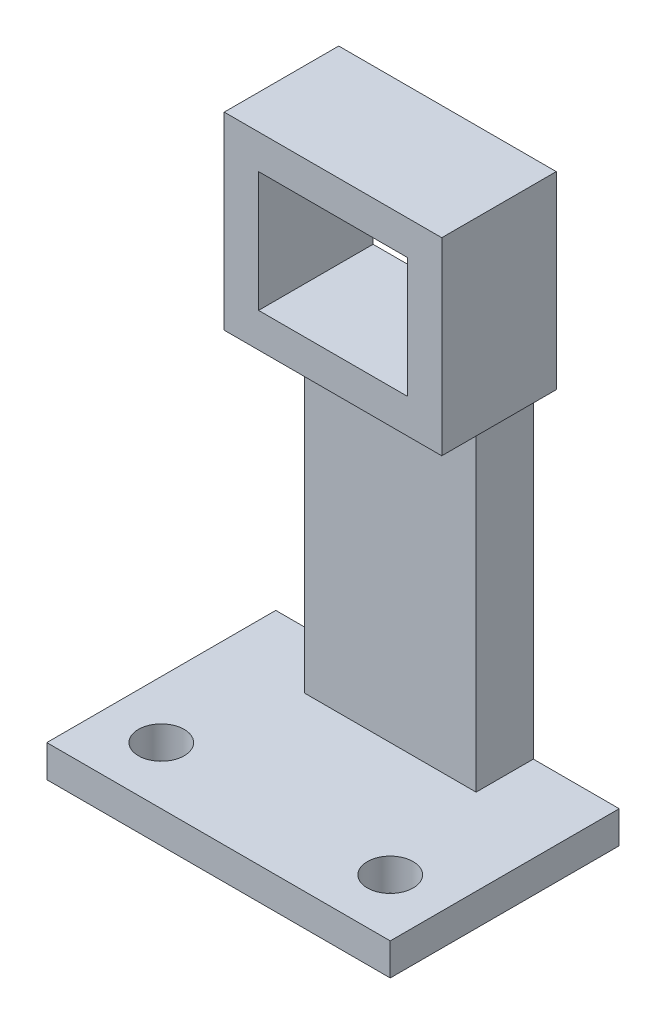
ISO-10303-21;
HEADER;
FILE_DESCRIPTION(('STEP AP214'),'2;1');
FILE_NAME('part.step','',(''),(''),'','','');
FILE_SCHEMA(('AUTOMOTIVE_DESIGN { 1 0 10303 214 1 1 1 1 }'));
ENDSEC;
DATA;
#1=APPLICATION_CONTEXT('core data for automotive mechanical design processes');
#2=APPLICATION_PROTOCOL_DEFINITION('international standard','automotive_design',2000,#1);
#3=PRODUCT_CONTEXT('',#1,'mechanical');
#4=PRODUCT('Part','Part','',(#3));
#5=PRODUCT_RELATED_PRODUCT_CATEGORY('part','',(#4));
#6=PRODUCT_DEFINITION_FORMATION('','',#4);
#7=PRODUCT_DEFINITION_CONTEXT('part definition',#1,'design');
#8=PRODUCT_DEFINITION('design','',#6,#7);
#9=PRODUCT_DEFINITION_SHAPE('','',#8);
#10=(LENGTH_UNIT() NAMED_UNIT(*) SI_UNIT(.MILLI.,.METRE.));
#11=(NAMED_UNIT(*) PLANE_ANGLE_UNIT() SI_UNIT($,.RADIAN.));
#12=(NAMED_UNIT(*) SI_UNIT($,.STERADIAN.) SOLID_ANGLE_UNIT());
#13=UNCERTAINTY_MEASURE_WITH_UNIT(LENGTH_MEASURE(1.E-05),#10,'distance_accuracy_value','');
#14=(GEOMETRIC_REPRESENTATION_CONTEXT(3) GLOBAL_UNCERTAINTY_ASSIGNED_CONTEXT((#13)) GLOBAL_UNIT_ASSIGNED_CONTEXT((#10,
#11,#12)) REPRESENTATION_CONTEXT('',''));
#15=CARTESIAN_POINT('',(0.,0.,0.));
#16=DIRECTION('',(0.,0.,1.));
#17=DIRECTION('',(1.,0.,0.));
#18=AXIS2_PLACEMENT_3D('',#15,#16,#17);
#19=CARTESIAN_POINT('',(0.,-5.25,10.));
#20=DIRECTION('',(0.,-1.,0.));
#21=DIRECTION('',(1.,0.,0.));
#22=AXIS2_PLACEMENT_3D('',#19,#20,#21);
#23=PLANE('',#22);
#24=DIRECTION('',(-1.,0.,0.));
#25=VECTOR('',#24,1.);
#26=CARTESIAN_POINT('',(0.,-5.25,0.));
#27=LINE('',#26,#25);
#28=CARTESIAN_POINT('',(6.5,-5.25,0.));
#29=VERTEX_POINT('',#28);
#30=CARTESIAN_POINT('',(-6.5,-5.25,0.));
#31=VERTEX_POINT('',#30);
#32=EDGE_CURVE('E169',#29,#31,#27,.T.);
#33=ORIENTED_EDGE('',*,*,#32,.T.);
#34=DIRECTION('',(0.,0.,-1.));
#35=VECTOR('',#34,1.);
#36=CARTESIAN_POINT('',(-6.5,-5.25,10.));
#37=LINE('',#36,#35);
#38=CARTESIAN_POINT('',(-6.5,-5.25,10.));
#39=VERTEX_POINT('',#38);
#40=EDGE_CURVE('E11',#39,#31,#37,.T.);
#41=ORIENTED_EDGE('',*,*,#40,.F.);
#42=DIRECTION('',(-1.,0.,0.));
#43=VECTOR('',#42,1.);
#44=CARTESIAN_POINT('',(0.,-5.25,10.));
#45=LINE('',#44,#43);
#46=CARTESIAN_POINT('',(6.5,-5.25,10.));
#47=VERTEX_POINT('',#46);
#48=EDGE_CURVE('E140',#47,#39,#45,.T.);
#49=ORIENTED_EDGE('',*,*,#48,.F.);
#50=DIRECTION('',(0.,0.,-1.));
#51=VECTOR('',#50,1.);
#52=CARTESIAN_POINT('',(6.5,-5.25,10.));
#53=LINE('',#52,#51);
#54=EDGE_CURVE('E180',#47,#29,#53,.T.);
#55=ORIENTED_EDGE('',*,*,#54,.T.);
#56=EDGE_LOOP('',(#33,#41,#49,#55));
#57=FACE_BOUND('',#56,.T.);
#58=ADVANCED_FACE('F39',(#57),#23,.F.);
#59=CARTESIAN_POINT('',(-6.5,0.,10.));
#60=DIRECTION('',(1.,0.,0.));
#61=DIRECTION('',(0.,0.,-1.));
#62=AXIS2_PLACEMENT_3D('',#59,#60,#61);
#63=PLANE('',#62);
#64=DIRECTION('',(0.,-1.,0.));
#65=VECTOR('',#64,1.);
#66=CARTESIAN_POINT('',(-6.5,0.,0.));
#67=LINE('',#66,#65);
#68=CARTESIAN_POINT('',(-6.5,5.25,0.));
#69=VERTEX_POINT('',#68);
#70=EDGE_CURVE('E129',#69,#31,#67,.T.);
#71=ORIENTED_EDGE('',*,*,#70,.F.);
#72=DIRECTION('',(0.,0.,-1.));
#73=VECTOR('',#72,1.);
#74=CARTESIAN_POINT('',(-6.5,5.25,10.));
#75=LINE('',#74,#73);
#76=CARTESIAN_POINT('',(-6.5,5.25,10.));
#77=VERTEX_POINT('',#76);
#78=EDGE_CURVE('E49',#77,#69,#75,.T.);
#79=ORIENTED_EDGE('',*,*,#78,.F.);
#80=DIRECTION('',(0.,-1.,0.));
#81=VECTOR('',#80,1.);
#82=CARTESIAN_POINT('',(-6.5,0.,10.));
#83=LINE('',#82,#81);
#84=EDGE_CURVE('E127',#77,#39,#83,.T.);
#85=ORIENTED_EDGE('',*,*,#84,.T.);
#86=ORIENTED_EDGE('',*,*,#40,.T.);
#87=EDGE_LOOP('',(#71,#79,#85,#86));
#88=FACE_BOUND('',#87,.T.);
#89=ADVANCED_FACE('F126',(#88),#63,.T.);
#90=CARTESIAN_POINT('',(0.,5.25,10.));
#91=DIRECTION('',(0.,-1.,0.));
#92=DIRECTION('',(1.,0.,0.));
#93=AXIS2_PLACEMENT_3D('',#90,#91,#92);
#94=PLANE('',#93);
#95=DIRECTION('',(-1.,0.,0.));
#96=VECTOR('',#95,1.);
#97=CARTESIAN_POINT('',(0.,5.25,0.));
#98=LINE('',#97,#96);
#99=CARTESIAN_POINT('',(6.5,5.25,0.));
#100=VERTEX_POINT('',#99);
#101=EDGE_CURVE('E175',#100,#69,#98,.T.);
#102=ORIENTED_EDGE('',*,*,#101,.F.);
#103=DIRECTION('',(0.,0.,-1.));
#104=VECTOR('',#103,1.);
#105=CARTESIAN_POINT('',(6.5,5.25,10.));
#106=LINE('',#105,#104);
#107=CARTESIAN_POINT('',(6.5,5.25,10.));
#108=VERTEX_POINT('',#107);
#109=EDGE_CURVE('E135',#108,#100,#106,.T.);
#110=ORIENTED_EDGE('',*,*,#109,.F.);
#111=DIRECTION('',(-1.,0.,0.));
#112=VECTOR('',#111,1.);
#113=CARTESIAN_POINT('',(0.,5.25,10.));
#114=LINE('',#113,#112);
#115=EDGE_CURVE('E138',#108,#77,#114,.T.);
#116=ORIENTED_EDGE('',*,*,#115,.T.);
#117=ORIENTED_EDGE('',*,*,#78,.T.);
#118=EDGE_LOOP('',(#102,#110,#116,#117));
#119=FACE_BOUND('',#118,.T.);
#120=ADVANCED_FACE('F144',(#119),#94,.T.);
#121=CARTESIAN_POINT('',(-9.5,0.,10.));
#122=DIRECTION('',(1.,0.,0.));
#123=DIRECTION('',(0.,0.,-1.));
#124=AXIS2_PLACEMENT_3D('',#121,#122,#123);
#125=PLANE('',#124);
#126=DIRECTION('',(0.,-1.,0.));
#127=VECTOR('',#126,1.);
#128=CARTESIAN_POINT('',(-9.5,0.,0.));
#129=LINE('',#128,#127);
#130=CARTESIAN_POINT('',(-9.5,8.25,0.));
#131=VERTEX_POINT('',#130);
#132=CARTESIAN_POINT('',(-9.5,-8.25,0.));
#133=VERTEX_POINT('',#132);
#134=EDGE_CURVE('E152',#131,#133,#129,.T.);
#135=ORIENTED_EDGE('',*,*,#134,.T.);
#136=DIRECTION('',(0.,0.,-1.));
#137=VECTOR('',#136,1.);
#138=CARTESIAN_POINT('',(-9.5,-8.25,10.));
#139=LINE('',#138,#137);
#140=CARTESIAN_POINT('',(-9.5,-8.25,10.));
#141=VERTEX_POINT('',#140);
#142=EDGE_CURVE('E183',#141,#133,#139,.T.);
#143=ORIENTED_EDGE('',*,*,#142,.F.);
#144=DIRECTION('',(0.,-1.,0.));
#145=VECTOR('',#144,1.);
#146=CARTESIAN_POINT('',(-9.5,0.,10.));
#147=LINE('',#146,#145);
#148=CARTESIAN_POINT('',(-9.5,8.25,10.));
#149=VERTEX_POINT('',#148);
#150=EDGE_CURVE('E107',#149,#141,#147,.T.);
#151=ORIENTED_EDGE('',*,*,#150,.F.);
#152=DIRECTION('',(0.,0.,-1.));
#153=VECTOR('',#152,1.);
#154=CARTESIAN_POINT('',(-9.5,8.25,10.));
#155=LINE('',#154,#153);
#156=EDGE_CURVE('E148',#149,#131,#155,.T.);
#157=ORIENTED_EDGE('',*,*,#156,.T.);
#158=EDGE_LOOP('',(#135,#143,#151,#157));
#159=FACE_BOUND('',#158,.T.);
#160=ADVANCED_FACE('F41',(#159),#125,.F.);
#161=CARTESIAN_POINT('',(0.,-8.25,10.));
#162=DIRECTION('',(0.,-1.,0.));
#163=DIRECTION('',(0.,0.,-1.));
#164=AXIS2_PLACEMENT_3D('',#161,#162,#163);
#165=PLANE('',#164);
#166=DIRECTION('',(0.,0.,-1.));
#167=VECTOR('',#166,1.);
#168=CARTESIAN_POINT('',(-7.5,-8.25,5.));
#169=LINE('',#168,#167);
#170=CARTESIAN_POINT('',(-7.5,-8.25,5.));
#171=VERTEX_POINT('',#170);
#172=CARTESIAN_POINT('',(-7.5,-8.25,0.));
#173=VERTEX_POINT('',#172);
#174=EDGE_CURVE('E281',#171,#173,#169,.T.);
#175=ORIENTED_EDGE('',*,*,#174,.F.);
#176=DIRECTION('',(-1.,0.,0.));
#177=VECTOR('',#176,1.);
#178=CARTESIAN_POINT('',(0.,-8.25,5.));
#179=LINE('',#178,#177);
#180=CARTESIAN_POINT('',(7.50000000000001,-8.25,5.));
#181=VERTEX_POINT('',#180);
#182=EDGE_CURVE('E277',#181,#171,#179,.T.);
#183=ORIENTED_EDGE('',*,*,#182,.F.);
#184=DIRECTION('',(0.,0.,-1.));
#185=VECTOR('',#184,1.);
#186=CARTESIAN_POINT('',(7.50000000000001,-8.25,5.));
#187=LINE('',#186,#185);
#188=CARTESIAN_POINT('',(7.50000000000001,-8.25,0.));
#189=VERTEX_POINT('',#188);
#190=EDGE_CURVE('E290',#181,#189,#187,.T.);
#191=ORIENTED_EDGE('',*,*,#190,.T.);
#192=DIRECTION('',(-1.,0.,0.));
#193=VECTOR('',#192,1.);
#194=CARTESIAN_POINT('',(0.,-8.25,0.));
#195=LINE('',#194,#193);
#196=CARTESIAN_POINT('',(9.5,-8.25,0.));
#197=VERTEX_POINT('',#196);
#198=EDGE_CURVE('E158',#197,#189,#195,.T.);
#199=ORIENTED_EDGE('',*,*,#198,.F.);
#200=DIRECTION('',(0.,0.,-1.));
#201=VECTOR('',#200,1.);
#202=CARTESIAN_POINT('',(9.5,-8.25,10.));
#203=LINE('',#202,#201);
#204=CARTESIAN_POINT('',(9.5,-8.25,10.));
#205=VERTEX_POINT('',#204);
#206=EDGE_CURVE('E192',#205,#197,#203,.T.);
#207=ORIENTED_EDGE('',*,*,#206,.F.);
#208=DIRECTION('',(-1.,0.,0.));
#209=VECTOR('',#208,1.);
#210=CARTESIAN_POINT('',(0.,-8.25,10.));
#211=LINE('',#210,#209);
#212=EDGE_CURVE('E301',#205,#141,#211,.T.);
#213=ORIENTED_EDGE('',*,*,#212,.T.);
#214=ORIENTED_EDGE('',*,*,#142,.T.);
#215=EDGE_CURVE('E156',#173,#133,#195,.T.);
#216=ORIENTED_EDGE('',*,*,#215,.F.);
#217=EDGE_LOOP('',(#175,#183,#191,#199,#207,#213,#214,#216));
#218=FACE_BOUND('',#217,.T.);
#219=ADVANCED_FACE('F374',(#218),#165,.T.);
#220=CARTESIAN_POINT('',(9.5,0.,10.));
#221=DIRECTION('',(1.,0.,0.));
#222=DIRECTION('',(0.,0.,-1.));
#223=AXIS2_PLACEMENT_3D('',#220,#221,#222);
#224=PLANE('',#223);
#225=DIRECTION('',(0.,-1.,0.));
#226=VECTOR('',#225,1.);
#227=CARTESIAN_POINT('',(9.5,0.,0.));
#228=LINE('',#227,#226);
#229=CARTESIAN_POINT('',(9.5,8.25,0.));
#230=VERTEX_POINT('',#229);
#231=EDGE_CURVE('E162',#230,#197,#228,.T.);
#232=ORIENTED_EDGE('',*,*,#231,.F.);
#233=DIRECTION('',(0.,0.,-1.));
#234=VECTOR('',#233,1.);
#235=CARTESIAN_POINT('',(9.5,8.25,10.));
#236=LINE('',#235,#234);
#237=CARTESIAN_POINT('',(9.5,8.25,10.));
#238=VERTEX_POINT('',#237);
#239=EDGE_CURVE('E189',#238,#230,#236,.T.);
#240=ORIENTED_EDGE('',*,*,#239,.F.);
#241=DIRECTION('',(0.,-1.,0.));
#242=VECTOR('',#241,1.);
#243=CARTESIAN_POINT('',(9.5,0.,10.));
#244=LINE('',#243,#242);
#245=EDGE_CURVE('E305',#238,#205,#244,.T.);
#246=ORIENTED_EDGE('',*,*,#245,.T.);
#247=ORIENTED_EDGE('',*,*,#206,.T.);
#248=EDGE_LOOP('',(#232,#240,#246,#247));
#249=FACE_BOUND('',#248,.T.);
#250=ADVANCED_FACE('F381',(#249),#224,.T.);
#251=CARTESIAN_POINT('',(0.,8.25,10.));
#252=DIRECTION('',(0.,-1.,0.));
#253=DIRECTION('',(0.,0.,-1.));
#254=AXIS2_PLACEMENT_3D('',#251,#252,#253);
#255=PLANE('',#254);
#256=DIRECTION('',(-1.,0.,0.));
#257=VECTOR('',#256,1.);
#258=CARTESIAN_POINT('',(0.,8.25,0.));
#259=LINE('',#258,#257);
#260=EDGE_CURVE('E166',#230,#131,#259,.T.);
#261=ORIENTED_EDGE('',*,*,#260,.T.);
#262=ORIENTED_EDGE('',*,*,#156,.F.);
#263=DIRECTION('',(-1.,0.,0.));
#264=VECTOR('',#263,1.);
#265=CARTESIAN_POINT('',(0.,8.25,10.));
#266=LINE('',#265,#264);
#267=EDGE_CURVE('E309',#238,#149,#266,.T.);
#268=ORIENTED_EDGE('',*,*,#267,.F.);
#269=ORIENTED_EDGE('',*,*,#239,.T.);
#270=EDGE_LOOP('',(#261,#262,#268,#269));
#271=FACE_BOUND('',#270,.T.);
#272=ADVANCED_FACE('F415',(#271),#255,.F.);
#273=CARTESIAN_POINT('',(6.5,0.,10.));
#274=DIRECTION('',(1.,0.,0.));
#275=DIRECTION('',(0.,1.,0.));
#276=AXIS2_PLACEMENT_3D('',#273,#274,#275);
#277=PLANE('',#276);
#278=DIRECTION('',(0.,-1.,0.));
#279=VECTOR('',#278,1.);
#280=CARTESIAN_POINT('',(6.5,0.,0.));
#281=LINE('',#280,#279);
#282=EDGE_CURVE('E98',#100,#29,#281,.T.);
#283=ORIENTED_EDGE('',*,*,#282,.T.);
#284=ORIENTED_EDGE('',*,*,#54,.F.);
#285=DIRECTION('',(0.,-1.,0.));
#286=VECTOR('',#285,1.);
#287=CARTESIAN_POINT('',(6.5,0.,10.));
#288=LINE('',#287,#286);
#289=EDGE_CURVE('E66',#108,#47,#288,.T.);
#290=ORIENTED_EDGE('',*,*,#289,.F.);
#291=ORIENTED_EDGE('',*,*,#109,.T.);
#292=EDGE_LOOP('',(#283,#284,#290,#291));
#293=FACE_BOUND('',#292,.T.);
#294=ADVANCED_FACE('F418',(#293),#277,.F.);
#295=CARTESIAN_POINT('',(0.,0.,10.));
#296=DIRECTION('',(0.,0.,1.));
#297=DIRECTION('',(1.,0.,0.));
#298=AXIS2_PLACEMENT_3D('',#295,#296,#297);
#299=PLANE('',#298);
#300=ORIENTED_EDGE('',*,*,#150,.T.);
#301=ORIENTED_EDGE('',*,*,#212,.F.);
#302=ORIENTED_EDGE('',*,*,#245,.F.);
#303=ORIENTED_EDGE('',*,*,#267,.T.);
#304=EDGE_LOOP('',(#300,#301,#302,#303));
#305=FACE_BOUND('',#304,.T.);
#306=ORIENTED_EDGE('',*,*,#48,.T.);
#307=ORIENTED_EDGE('',*,*,#84,.F.);
#308=ORIENTED_EDGE('',*,*,#115,.F.);
#309=ORIENTED_EDGE('',*,*,#289,.T.);
#310=EDGE_LOOP('',(#306,#307,#308,#309));
#311=FACE_BOUND('',#310,.T.);
#312=ADVANCED_FACE('F137',(#305,#311),#299,.T.);
#313=CARTESIAN_POINT('',(0.,0.,0.));
#314=DIRECTION('',(0.,0.,1.));
#315=DIRECTION('',(1.,0.,0.));
#316=AXIS2_PLACEMENT_3D('',#313,#314,#315);
#317=PLANE('',#316);
#318=ORIENTED_EDGE('',*,*,#134,.F.);
#319=ORIENTED_EDGE('',*,*,#260,.F.);
#320=ORIENTED_EDGE('',*,*,#231,.T.);
#321=ORIENTED_EDGE('',*,*,#198,.T.);
#322=DIRECTION('',(0.,-1.,0.));
#323=VECTOR('',#322,1.);
#324=CARTESIAN_POINT('',(7.5,0.,0.));
#325=LINE('',#324,#323);
#326=CARTESIAN_POINT('',(7.50000000000001,-37.192025954304,0.));
#327=VERTEX_POINT('',#326);
#328=EDGE_CURVE('E57',#189,#327,#325,.T.);
#329=ORIENTED_EDGE('',*,*,#328,.T.);
#330=DIRECTION('',(1.,0.,0.));
#331=VECTOR('',#330,1.);
#332=CARTESIAN_POINT('',(-15.,-37.192025954304,0.));
#333=LINE('',#332,#331);
#334=CARTESIAN_POINT('',(15.,-37.192025954304,0.));
#335=VERTEX_POINT('',#334);
#336=EDGE_CURVE('E237',#327,#335,#333,.T.);
#337=ORIENTED_EDGE('',*,*,#336,.T.);
#338=DIRECTION('',(0.,1.,0.));
#339=VECTOR('',#338,1.);
#340=CARTESIAN_POINT('',(15.,-40.,0.));
#341=LINE('',#340,#339);
#342=CARTESIAN_POINT('',(15.,-40.,0.));
#343=VERTEX_POINT('',#342);
#344=EDGE_CURVE('E242',#343,#335,#341,.T.);
#345=ORIENTED_EDGE('',*,*,#344,.F.);
#346=DIRECTION('',(1.,0.,0.));
#347=VECTOR('',#346,1.);
#348=CARTESIAN_POINT('',(-15.,-40.,0.));
#349=LINE('',#348,#347);
#350=CARTESIAN_POINT('',(-15.,-40.,0.));
#351=VERTEX_POINT('',#350);
#352=EDGE_CURVE('E221',#351,#343,#349,.T.);
#353=ORIENTED_EDGE('',*,*,#352,.F.);
#354=DIRECTION('',(0.,1.,0.));
#355=VECTOR('',#354,1.);
#356=CARTESIAN_POINT('',(-15.,-40.,0.));
#357=LINE('',#356,#355);
#358=CARTESIAN_POINT('',(-15.,-37.192025954304,0.));
#359=VERTEX_POINT('',#358);
#360=EDGE_CURVE('E206',#351,#359,#357,.T.);
#361=ORIENTED_EDGE('',*,*,#360,.T.);
#362=CARTESIAN_POINT('',(-7.49999999999999,-37.192025954304,0.));
#363=VERTEX_POINT('',#362);
#364=EDGE_CURVE('E238',#359,#363,#333,.T.);
#365=ORIENTED_EDGE('',*,*,#364,.T.);
#366=DIRECTION('',(0.,-1.,0.));
#367=VECTOR('',#366,1.);
#368=CARTESIAN_POINT('',(-7.5,0.,0.));
#369=LINE('',#368,#367);
#370=EDGE_CURVE('E253',#173,#363,#369,.T.);
#371=ORIENTED_EDGE('',*,*,#370,.F.);
#372=ORIENTED_EDGE('',*,*,#215,.T.);
#373=EDGE_LOOP('',(#318,#319,#320,#321,#329,#337,#345,#353,#361,#365,#371,#372));
#374=FACE_BOUND('',#373,.T.);
#375=ORIENTED_EDGE('',*,*,#32,.F.);
#376=ORIENTED_EDGE('',*,*,#282,.F.);
#377=ORIENTED_EDGE('',*,*,#101,.T.);
#378=ORIENTED_EDGE('',*,*,#70,.T.);
#379=EDGE_LOOP('',(#375,#376,#377,#378));
#380=FACE_BOUND('',#379,.T.);
#381=ADVANCED_FACE('F320',(#374,#380),#317,.F.);
#382=CARTESIAN_POINT('',(-7.5,0.,5.));
#383=DIRECTION('',(1.,0.,0.));
#384=DIRECTION('',(0.,1.,0.));
#385=AXIS2_PLACEMENT_3D('',#382,#383,#384);
#386=PLANE('',#385);
#387=ORIENTED_EDGE('',*,*,#370,.T.);
#388=DIRECTION('',(0.,0.,-1.));
#389=VECTOR('',#388,1.);
#390=CARTESIAN_POINT('',(-7.49999999999999,-37.192025954304,5.));
#391=LINE('',#390,#389);
#392=CARTESIAN_POINT('',(-7.49999999999999,-37.192025954304,5.));
#393=VERTEX_POINT('',#392);
#394=EDGE_CURVE('E157',#393,#363,#391,.T.);
#395=ORIENTED_EDGE('',*,*,#394,.F.);
#396=DIRECTION('',(0.,-1.,0.));
#397=VECTOR('',#396,1.);
#398=CARTESIAN_POINT('',(-7.5,0.,5.));
#399=LINE('',#398,#397);
#400=EDGE_CURVE('E265',#171,#393,#399,.T.);
#401=ORIENTED_EDGE('',*,*,#400,.F.);
#402=ORIENTED_EDGE('',*,*,#174,.T.);
#403=EDGE_LOOP('',(#387,#395,#401,#402));
#404=FACE_BOUND('',#403,.T.);
#405=ADVANCED_FACE('F368',(#404),#386,.F.);
#406=CARTESIAN_POINT('',(7.5,0.,5.));
#407=DIRECTION('',(1.,0.,0.));
#408=DIRECTION('',(0.,1.,0.));
#409=AXIS2_PLACEMENT_3D('',#406,#407,#408);
#410=PLANE('',#409);
#411=ORIENTED_EDGE('',*,*,#328,.F.);
#412=ORIENTED_EDGE('',*,*,#190,.F.);
#413=DIRECTION('',(0.,-1.,0.));
#414=VECTOR('',#413,1.);
#415=CARTESIAN_POINT('',(7.5,0.,5.));
#416=LINE('',#415,#414);
#417=CARTESIAN_POINT('',(7.50000000000001,-37.192025954304,5.));
#418=VERTEX_POINT('',#417);
#419=EDGE_CURVE('E273',#181,#418,#416,.T.);
#420=ORIENTED_EDGE('',*,*,#419,.T.);
#421=DIRECTION('',(0.,0.,-1.));
#422=VECTOR('',#421,1.);
#423=CARTESIAN_POINT('',(7.50000000000001,-37.192025954304,5.));
#424=LINE('',#423,#422);
#425=EDGE_CURVE('E293',#418,#327,#424,.T.);
#426=ORIENTED_EDGE('',*,*,#425,.T.);
#427=EDGE_LOOP('',(#411,#412,#420,#426));
#428=FACE_BOUND('',#427,.T.);
#429=ADVANCED_FACE('F386',(#428),#410,.T.);
#430=CARTESIAN_POINT('',(0.,0.,5.));
#431=DIRECTION('',(0.,0.,1.));
#432=DIRECTION('',(1.,0.,0.));
#433=AXIS2_PLACEMENT_3D('',#430,#431,#432);
#434=PLANE('',#433);
#435=ORIENTED_EDGE('',*,*,#400,.T.);
#436=DIRECTION('',(1.,0.,0.));
#437=VECTOR('',#436,1.);
#438=CARTESIAN_POINT('',(0.,-37.192025954304,5.));
#439=LINE('',#438,#437);
#440=EDGE_CURVE('E269',#393,#418,#439,.T.);
#441=ORIENTED_EDGE('',*,*,#440,.T.);
#442=ORIENTED_EDGE('',*,*,#419,.F.);
#443=ORIENTED_EDGE('',*,*,#182,.T.);
#444=EDGE_LOOP('',(#435,#441,#442,#443));
#445=FACE_BOUND('',#444,.T.);
#446=ADVANCED_FACE('F388',(#445),#434,.T.);
#447=CARTESIAN_POINT('',(-15.,-37.192025954304,20.));
#448=DIRECTION('',(0.,1.,0.));
#449=DIRECTION('',(0.,0.,1.));
#450=AXIS2_PLACEMENT_3D('',#447,#448,#449);
#451=PLANE('',#450);
#452=CARTESIAN_POINT('',(-9.99999999999999,-37.192025954304,15.));
#453=DIRECTION('',(0.,1.,0.));
#454=DIRECTION('',(0.,0.,1.));
#455=AXIS2_PLACEMENT_3D('',#452,#453,#454);
#456=CIRCLE('',#455,2.);
#457=CARTESIAN_POINT('',(-9.99999999999999,-37.192025954304,17.));
#458=VERTEX_POINT('',#457);
#459=EDGE_CURVE('E200',#458,#458,#456,.T.);
#460=ORIENTED_EDGE('',*,*,#459,.F.);
#461=EDGE_LOOP('',(#460));
#462=FACE_BOUND('',#461,.T.);
#463=CARTESIAN_POINT('',(10.,-37.192025954304,15.));
#464=DIRECTION('',(0.,1.,0.));
#465=DIRECTION('',(0.,0.,1.));
#466=AXIS2_PLACEMENT_3D('',#463,#464,#465);
#467=CIRCLE('',#466,2.);
#468=CARTESIAN_POINT('',(10.,-37.192025954304,17.));
#469=VERTEX_POINT('',#468);
#470=EDGE_CURVE('E208',#469,#469,#467,.T.);
#471=ORIENTED_EDGE('',*,*,#470,.F.);
#472=EDGE_LOOP('',(#471));
#473=FACE_BOUND('',#472,.T.);
#474=ORIENTED_EDGE('',*,*,#425,.F.);
#475=ORIENTED_EDGE('',*,*,#440,.F.);
#476=ORIENTED_EDGE('',*,*,#394,.T.);
#477=ORIENTED_EDGE('',*,*,#364,.F.);
#478=DIRECTION('',(0.,0.,-1.));
#479=VECTOR('',#478,1.);
#480=CARTESIAN_POINT('',(-15.,-37.192025954304,20.));
#481=LINE('',#480,#479);
#482=CARTESIAN_POINT('',(-15.,-37.192025954304,20.));
#483=VERTEX_POINT('',#482);
#484=EDGE_CURVE('E233',#483,#359,#481,.T.);
#485=ORIENTED_EDGE('',*,*,#484,.F.);
#486=DIRECTION('',(1.,0.,0.));
#487=VECTOR('',#486,1.);
#488=CARTESIAN_POINT('',(-15.,-37.192025954304,20.));
#489=LINE('',#488,#487);
#490=CARTESIAN_POINT('',(15.,-37.192025954304,20.));
#491=VERTEX_POINT('',#490);
#492=EDGE_CURVE('E220',#483,#491,#489,.T.);
#493=ORIENTED_EDGE('',*,*,#492,.T.);
#494=DIRECTION('',(0.,0.,-1.));
#495=VECTOR('',#494,1.);
#496=CARTESIAN_POINT('',(15.,-37.192025954304,20.));
#497=LINE('',#496,#495);
#498=EDGE_CURVE('E258',#491,#335,#497,.T.);
#499=ORIENTED_EDGE('',*,*,#498,.T.);
#500=ORIENTED_EDGE('',*,*,#336,.F.);
#501=EDGE_LOOP('',(#474,#475,#476,#477,#485,#493,#499,#500));
#502=FACE_BOUND('',#501,.T.);
#503=ADVANCED_FACE('F330',(#462,#473,#502),#451,.T.);
#504=CARTESIAN_POINT('',(-15.,-40.,20.));
#505=DIRECTION('',(-1.,0.,0.));
#506=DIRECTION('',(0.,0.,1.));
#507=AXIS2_PLACEMENT_3D('',#504,#505,#506);
#508=PLANE('',#507);
#509=ORIENTED_EDGE('',*,*,#360,.F.);
#510=DIRECTION('',(0.,0.,-1.));
#511=VECTOR('',#510,1.);
#512=CARTESIAN_POINT('',(-15.,-40.,20.));
#513=LINE('',#512,#511);
#514=CARTESIAN_POINT('',(-15.,-40.,20.));
#515=VERTEX_POINT('',#514);
#516=EDGE_CURVE('E249',#515,#351,#513,.T.);
#517=ORIENTED_EDGE('',*,*,#516,.F.);
#518=DIRECTION('',(0.,1.,0.));
#519=VECTOR('',#518,1.);
#520=CARTESIAN_POINT('',(-15.,-40.,20.));
#521=LINE('',#520,#519);
#522=EDGE_CURVE('E216',#515,#483,#521,.T.);
#523=ORIENTED_EDGE('',*,*,#522,.T.);
#524=ORIENTED_EDGE('',*,*,#484,.T.);
#525=EDGE_LOOP('',(#509,#517,#523,#524));
#526=FACE_BOUND('',#525,.T.);
#527=ADVANCED_FACE('F392',(#526),#508,.T.);
#528=CARTESIAN_POINT('',(-15.,-40.,20.));
#529=DIRECTION('',(0.,1.,0.));
#530=DIRECTION('',(0.,0.,1.));
#531=AXIS2_PLACEMENT_3D('',#528,#529,#530);
#532=PLANE('',#531);
#533=CARTESIAN_POINT('',(-9.99999999999999,-40.,15.));
#534=DIRECTION('',(0.,1.,0.));
#535=DIRECTION('',(0.,0.,1.));
#536=AXIS2_PLACEMENT_3D('',#533,#534,#535);
#537=CIRCLE('',#536,2.);
#538=CARTESIAN_POINT('',(-9.99999999999999,-40.,17.));
#539=VERTEX_POINT('',#538);
#540=EDGE_CURVE('E43',#539,#539,#537,.T.);
#541=ORIENTED_EDGE('',*,*,#540,.T.);
#542=EDGE_LOOP('',(#541));
#543=FACE_BOUND('',#542,.T.);
#544=CARTESIAN_POINT('',(10.,-40.,15.));
#545=DIRECTION('',(0.,1.,0.));
#546=DIRECTION('',(0.,0.,1.));
#547=AXIS2_PLACEMENT_3D('',#544,#545,#546);
#548=CIRCLE('',#547,2.);
#549=CARTESIAN_POINT('',(10.,-40.,17.));
#550=VERTEX_POINT('',#549);
#551=EDGE_CURVE('E197',#550,#550,#548,.T.);
#552=ORIENTED_EDGE('',*,*,#551,.T.);
#553=EDGE_LOOP('',(#552));
#554=FACE_BOUND('',#553,.T.);
#555=ORIENTED_EDGE('',*,*,#352,.T.);
#556=DIRECTION('',(0.,0.,-1.));
#557=VECTOR('',#556,1.);
#558=CARTESIAN_POINT('',(15.,-40.,20.));
#559=LINE('',#558,#557);
#560=CARTESIAN_POINT('',(15.,-40.,20.));
#561=VERTEX_POINT('',#560);
#562=EDGE_CURVE('E254',#561,#343,#559,.T.);
#563=ORIENTED_EDGE('',*,*,#562,.F.);
#564=DIRECTION('',(1.,0.,0.));
#565=VECTOR('',#564,1.);
#566=CARTESIAN_POINT('',(-15.,-40.,20.));
#567=LINE('',#566,#565);
#568=EDGE_CURVE('E229',#515,#561,#567,.T.);
#569=ORIENTED_EDGE('',*,*,#568,.F.);
#570=ORIENTED_EDGE('',*,*,#516,.T.);
#571=EDGE_LOOP('',(#555,#563,#569,#570));
#572=FACE_BOUND('',#571,.T.);
#573=ADVANCED_FACE('F343',(#543,#554,#572),#532,.F.);
#574=CARTESIAN_POINT('',(15.,-40.,20.));
#575=DIRECTION('',(-1.,0.,0.));
#576=DIRECTION('',(0.,0.,1.));
#577=AXIS2_PLACEMENT_3D('',#574,#575,#576);
#578=PLANE('',#577);
#579=ORIENTED_EDGE('',*,*,#344,.T.);
#580=ORIENTED_EDGE('',*,*,#498,.F.);
#581=DIRECTION('',(0.,1.,0.));
#582=VECTOR('',#581,1.);
#583=CARTESIAN_POINT('',(15.,-40.,20.));
#584=LINE('',#583,#582);
#585=EDGE_CURVE('E225',#561,#491,#584,.T.);
#586=ORIENTED_EDGE('',*,*,#585,.F.);
#587=ORIENTED_EDGE('',*,*,#562,.T.);
#588=EDGE_LOOP('',(#579,#580,#586,#587));
#589=FACE_BOUND('',#588,.T.);
#590=ADVANCED_FACE('F336',(#589),#578,.F.);
#591=CARTESIAN_POINT('',(0.,0.,20.));
#592=DIRECTION('',(0.,0.,-1.));
#593=DIRECTION('',(-1.,0.,0.));
#594=AXIS2_PLACEMENT_3D('',#591,#592,#593);
#595=PLANE('',#594);
#596=ORIENTED_EDGE('',*,*,#522,.F.);
#597=ORIENTED_EDGE('',*,*,#568,.T.);
#598=ORIENTED_EDGE('',*,*,#585,.T.);
#599=ORIENTED_EDGE('',*,*,#492,.F.);
#600=EDGE_LOOP('',(#596,#597,#598,#599));
#601=FACE_BOUND('',#600,.T.);
#602=ADVANCED_FACE('F393',(#601),#595,.F.);
#603=CARTESIAN_POINT('',(10.,-57.192025954304,15.));
#604=DIRECTION('',(0.,1.,0.));
#605=DIRECTION('',(0.,0.,1.));
#606=AXIS2_PLACEMENT_3D('',#603,#604,#605);
#607=CYLINDRICAL_SURFACE('',#606,2.);
#608=ORIENTED_EDGE('',*,*,#470,.T.);
#609=EDGE_LOOP('',(#608));
#610=FACE_BOUND('',#609,.T.);
#611=ORIENTED_EDGE('',*,*,#551,.F.);
#612=EDGE_LOOP('',(#611));
#613=FACE_BOUND('',#612,.T.);
#614=ADVANCED_FACE('F395',(#610,#613),#607,.F.);
#615=CARTESIAN_POINT('',(-9.99999999999999,-57.192025954304,15.));
#616=DIRECTION('',(0.,1.,0.));
#617=DIRECTION('',(0.,0.,1.));
#618=AXIS2_PLACEMENT_3D('',#615,#616,#617);
#619=CYLINDRICAL_SURFACE('',#618,2.);
#620=ORIENTED_EDGE('',*,*,#459,.T.);
#621=EDGE_LOOP('',(#620));
#622=FACE_BOUND('',#621,.T.);
#623=ORIENTED_EDGE('',*,*,#540,.F.);
#624=EDGE_LOOP('',(#623));
#625=FACE_BOUND('',#624,.T.);
#626=ADVANCED_FACE('F401',(#622,#625),#619,.F.);
#627=CLOSED_SHELL('',(#58,#89,#120,#160,#219,#250,#272,#294,#312,#381,#405,#429,#446,#503,#527,
#573,#590,#602,#614,#626));
#628=MANIFOLD_SOLID_BREP('B2',#627);
#629=ADVANCED_BREP_SHAPE_REPRESENTATION('',(#18,#628),#14);
#630=SHAPE_DEFINITION_REPRESENTATION(#9,#629);
ENDSEC;
END-ISO-10303-21;
